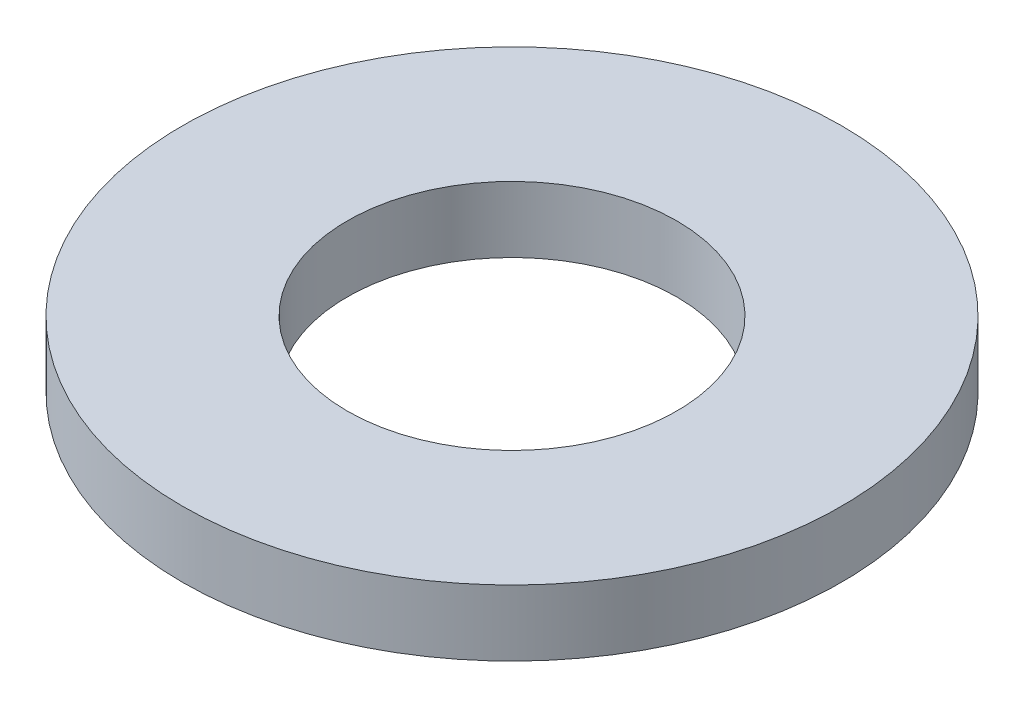
ISO-10303-21;
HEADER;
FILE_DESCRIPTION(('STEP AP214'),'2;1');
FILE_NAME('part.step','',(''),(''),'','','');
FILE_SCHEMA(('AUTOMOTIVE_DESIGN { 1 0 10303 214 1 1 1 1 }'));
ENDSEC;
DATA;
#1=APPLICATION_CONTEXT('core data for automotive mechanical design processes');
#2=APPLICATION_PROTOCOL_DEFINITION('international standard','automotive_design',2000,#1);
#3=PRODUCT_CONTEXT('',#1,'mechanical');
#4=PRODUCT('Part','Part','',(#3));
#5=PRODUCT_RELATED_PRODUCT_CATEGORY('part','',(#4));
#6=PRODUCT_DEFINITION_FORMATION('','',#4);
#7=PRODUCT_DEFINITION_CONTEXT('part definition',#1,'design');
#8=PRODUCT_DEFINITION('design','',#6,#7);
#9=PRODUCT_DEFINITION_SHAPE('','',#8);
#10=(LENGTH_UNIT() NAMED_UNIT(*) SI_UNIT(.MILLI.,.METRE.));
#11=(NAMED_UNIT(*) PLANE_ANGLE_UNIT() SI_UNIT($,.RADIAN.));
#12=(NAMED_UNIT(*) SI_UNIT($,.STERADIAN.) SOLID_ANGLE_UNIT());
#13=UNCERTAINTY_MEASURE_WITH_UNIT(LENGTH_MEASURE(1.E-05),#10,'distance_accuracy_value','');
#14=(GEOMETRIC_REPRESENTATION_CONTEXT(3) GLOBAL_UNCERTAINTY_ASSIGNED_CONTEXT((#13)) GLOBAL_UNIT_ASSIGNED_CONTEXT((#10,
#11,#12)) REPRESENTATION_CONTEXT('',''));
#15=CARTESIAN_POINT('',(0.,0.,0.));
#16=DIRECTION('',(0.,0.,1.));
#17=DIRECTION('',(1.,0.,0.));
#18=AXIS2_PLACEMENT_3D('',#15,#16,#17);
#19=CARTESIAN_POINT('',(0.,50.,0.));
#20=DIRECTION('',(0.,1.,0.));
#21=DIRECTION('',(0.,0.,1.));
#22=AXIS2_PLACEMENT_3D('',#19,#20,#21);
#23=PLANE('',#22);
#24=CARTESIAN_POINT('',(0.,50.,0.));
#25=DIRECTION('',(0.,1.,0.));
#26=DIRECTION('',(0.,0.,1.));
#27=AXIS2_PLACEMENT_3D('',#24,#25,#26);
#28=CIRCLE('',#27,250.);
#29=CARTESIAN_POINT('',(0.,50.,250.));
#30=VERTEX_POINT('',#29);
#31=EDGE_CURVE('E10',#30,#30,#28,.T.);
#32=ORIENTED_EDGE('',*,*,#31,.T.);
#33=EDGE_LOOP('',(#32));
#34=FACE_BOUND('',#33,.T.);
#35=CARTESIAN_POINT('',(0.,50.,0.));
#36=DIRECTION('',(0.,1.,0.));
#37=DIRECTION('',(0.,0.,1.));
#38=AXIS2_PLACEMENT_3D('',#35,#36,#37);
#39=CIRCLE('',#38,125.);
#40=CARTESIAN_POINT('',(0.,50.,125.));
#41=VERTEX_POINT('',#40);
#42=EDGE_CURVE('E42',#41,#41,#39,.T.);
#43=ORIENTED_EDGE('',*,*,#42,.F.);
#44=EDGE_LOOP('',(#43));
#45=FACE_BOUND('',#44,.T.);
#46=ADVANCED_FACE('F31',(#34,#45),#23,.T.);
#47=CARTESIAN_POINT('',(0.,0.,0.));
#48=DIRECTION('',(0.,1.,0.));
#49=DIRECTION('',(0.,0.,1.));
#50=AXIS2_PLACEMENT_3D('',#47,#48,#49);
#51=PLANE('',#50);
#52=CARTESIAN_POINT('',(0.,0.,0.));
#53=DIRECTION('',(0.,1.,0.));
#54=DIRECTION('',(0.,0.,1.));
#55=AXIS2_PLACEMENT_3D('',#52,#53,#54);
#56=CIRCLE('',#55,250.);
#57=CARTESIAN_POINT('',(0.,0.,250.));
#58=VERTEX_POINT('',#57);
#59=EDGE_CURVE('E35',#58,#58,#56,.T.);
#60=ORIENTED_EDGE('',*,*,#59,.F.);
#61=EDGE_LOOP('',(#60));
#62=FACE_BOUND('',#61,.T.);
#63=CARTESIAN_POINT('',(0.,0.,0.));
#64=DIRECTION('',(0.,1.,0.));
#65=DIRECTION('',(0.,0.,1.));
#66=AXIS2_PLACEMENT_3D('',#63,#64,#65);
#67=CIRCLE('',#66,125.);
#68=CARTESIAN_POINT('',(0.,0.,125.));
#69=VERTEX_POINT('',#68);
#70=EDGE_CURVE('E44',#69,#69,#67,.T.);
#71=ORIENTED_EDGE('',*,*,#70,.T.);
#72=EDGE_LOOP('',(#71));
#73=FACE_BOUND('',#72,.T.);
#74=ADVANCED_FACE('F54',(#62,#73),#51,.F.);
#75=CARTESIAN_POINT('',(0.,50.,0.));
#76=DIRECTION('',(0.,-1.,0.));
#77=DIRECTION('',(0.,0.,-1.));
#78=AXIS2_PLACEMENT_3D('',#75,#76,#77);
#79=CYLINDRICAL_SURFACE('',#78,250.);
#80=ORIENTED_EDGE('',*,*,#31,.F.);
#81=EDGE_LOOP('',(#80));
#82=FACE_BOUND('',#81,.T.);
#83=ORIENTED_EDGE('',*,*,#59,.T.);
#84=EDGE_LOOP('',(#83));
#85=FACE_BOUND('',#84,.T.);
#86=ADVANCED_FACE('F33',(#82,#85),#79,.T.);
#87=CARTESIAN_POINT('',(0.,50.,0.));
#88=DIRECTION('',(0.,-1.,0.));
#89=DIRECTION('',(0.,0.,-1.));
#90=AXIS2_PLACEMENT_3D('',#87,#88,#89);
#91=CYLINDRICAL_SURFACE('',#90,125.);
#92=ORIENTED_EDGE('',*,*,#42,.T.);
#93=EDGE_LOOP('',(#92));
#94=FACE_BOUND('',#93,.T.);
#95=ORIENTED_EDGE('',*,*,#70,.F.);
#96=EDGE_LOOP('',(#95));
#97=FACE_BOUND('',#96,.T.);
#98=ADVANCED_FACE('F50',(#94,#97),#91,.F.);
#99=CLOSED_SHELL('',(#46,#74,#86,#98));
#100=MANIFOLD_SOLID_BREP('B2',#99);
#101=ADVANCED_BREP_SHAPE_REPRESENTATION('',(#18,#100),#14);
#102=SHAPE_DEFINITION_REPRESENTATION(#9,#101);
ENDSEC;
END-ISO-10303-21;
